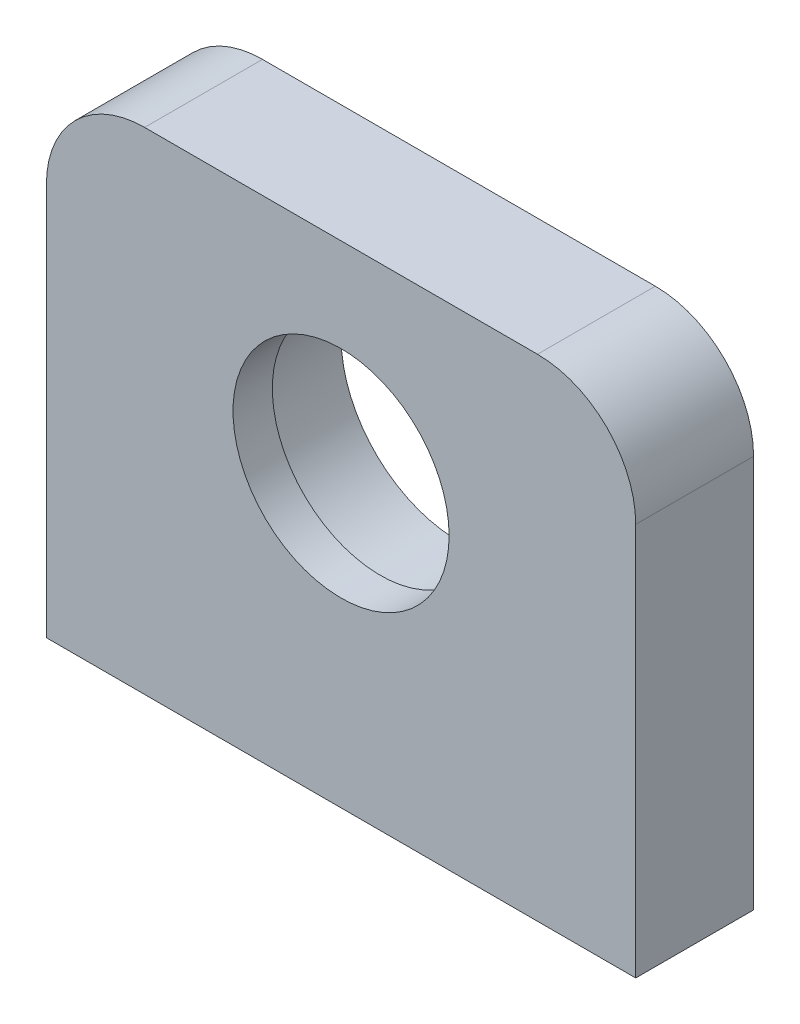
ISO-10303-21;
HEADER;
FILE_DESCRIPTION(('STEP AP214'),'2;1');
FILE_NAME('part.step','',(''),(''),'','','');
FILE_SCHEMA(('AUTOMOTIVE_DESIGN { 1 0 10303 214 1 1 1 1 }'));
ENDSEC;
DATA;
#1=APPLICATION_CONTEXT('core data for automotive mechanical design processes');
#2=APPLICATION_PROTOCOL_DEFINITION('international standard','automotive_design',2000,#1);
#3=PRODUCT_CONTEXT('',#1,'mechanical');
#4=PRODUCT('Part','Part','',(#3));
#5=PRODUCT_RELATED_PRODUCT_CATEGORY('part','',(#4));
#6=PRODUCT_DEFINITION_FORMATION('','',#4);
#7=PRODUCT_DEFINITION_CONTEXT('part definition',#1,'design');
#8=PRODUCT_DEFINITION('design','',#6,#7);
#9=PRODUCT_DEFINITION_SHAPE('','',#8);
#10=(LENGTH_UNIT() NAMED_UNIT(*) SI_UNIT(.MILLI.,.METRE.));
#11=(NAMED_UNIT(*) PLANE_ANGLE_UNIT() SI_UNIT($,.RADIAN.));
#12=(NAMED_UNIT(*) SI_UNIT($,.STERADIAN.) SOLID_ANGLE_UNIT());
#13=UNCERTAINTY_MEASURE_WITH_UNIT(LENGTH_MEASURE(1.E-05),#10,'distance_accuracy_value','');
#14=(GEOMETRIC_REPRESENTATION_CONTEXT(3) GLOBAL_UNCERTAINTY_ASSIGNED_CONTEXT((#13)) GLOBAL_UNIT_ASSIGNED_CONTEXT((#10,
#11,#12)) REPRESENTATION_CONTEXT('',''));
#15=CARTESIAN_POINT('',(0.,0.,0.));
#16=DIRECTION('',(0.,0.,1.));
#17=DIRECTION('',(1.,0.,0.));
#18=AXIS2_PLACEMENT_3D('',#15,#16,#17);
#19=CARTESIAN_POINT('',(30.,-25.,0.));
#20=DIRECTION('',(0.,0.,1.));
#21=DIRECTION('',(1.,0.,0.));
#22=AXIS2_PLACEMENT_3D('',#19,#20,#21);
#23=PLANE('',#22);
#24=CARTESIAN_POINT('',(0.,4.5,0.));
#25=DIRECTION('',(0.,0.,1.));
#26=DIRECTION('',(1.,0.,0.));
#27=AXIS2_PLACEMENT_3D('',#24,#25,#26);
#28=CIRCLE('',#27,12.);
#29=CARTESIAN_POINT('',(12.,4.5,0.));
#30=VERTEX_POINT('',#29);
#31=EDGE_CURVE('E397',#30,#30,#28,.F.);
#32=ORIENTED_EDGE('',*,*,#31,.F.);
#33=EDGE_LOOP('',(#32));
#34=FACE_BOUND('',#33,.T.);
#35=DIRECTION('',(0.,-1.,0.));
#36=VECTOR('',#35,1.);
#37=CARTESIAN_POINT('',(-30.,25.,0.));
#38=LINE('',#37,#36);
#39=CARTESIAN_POINT('',(-30.,15.,0.));
#40=VERTEX_POINT('',#39);
#41=CARTESIAN_POINT('',(-30.,-25.,0.));
#42=VERTEX_POINT('',#41);
#43=EDGE_CURVE('E420',#40,#42,#38,.T.);
#44=ORIENTED_EDGE('',*,*,#43,.F.);
#45=CARTESIAN_POINT('',(-20.,15.,0.));
#46=DIRECTION('',(0.,0.,1.));
#47=DIRECTION('',(1.,0.,0.));
#48=AXIS2_PLACEMENT_3D('',#45,#46,#47);
#49=CIRCLE('',#48,10.);
#50=CARTESIAN_POINT('',(-20.,25.,0.));
#51=VERTEX_POINT('',#50);
#52=EDGE_CURVE('E450',#40,#51,#49,.F.);
#53=ORIENTED_EDGE('',*,*,#52,.T.);
#54=DIRECTION('',(-1.,0.,0.));
#55=VECTOR('',#54,1.);
#56=CARTESIAN_POINT('',(-30.,25.,0.));
#57=LINE('',#56,#55);
#58=CARTESIAN_POINT('',(20.,25.,0.));
#59=VERTEX_POINT('',#58);
#60=EDGE_CURVE('E418',#59,#51,#57,.T.);
#61=ORIENTED_EDGE('',*,*,#60,.F.);
#62=CARTESIAN_POINT('',(20.,15.,0.));
#63=DIRECTION('',(0.,0.,1.));
#64=DIRECTION('',(1.,0.,0.));
#65=AXIS2_PLACEMENT_3D('',#62,#63,#64);
#66=CIRCLE('',#65,10.);
#67=CARTESIAN_POINT('',(30.,15.,0.));
#68=VERTEX_POINT('',#67);
#69=EDGE_CURVE('E448',#59,#68,#66,.F.);
#70=ORIENTED_EDGE('',*,*,#69,.T.);
#71=DIRECTION('',(0.,1.,0.));
#72=VECTOR('',#71,1.);
#73=CARTESIAN_POINT('',(30.,25.,0.));
#74=LINE('',#73,#72);
#75=CARTESIAN_POINT('',(30.,-25.,0.));
#76=VERTEX_POINT('',#75);
#77=EDGE_CURVE('E406',#76,#68,#74,.T.);
#78=ORIENTED_EDGE('',*,*,#77,.F.);
#79=DIRECTION('',(1.,0.,0.));
#80=VECTOR('',#79,1.);
#81=CARTESIAN_POINT('',(-30.,-25.,0.));
#82=LINE('',#81,#80);
#83=CARTESIAN_POINT('',(22.5,-25.,0.));
#84=VERTEX_POINT('',#83);
#85=EDGE_CURVE('E422',#84,#76,#82,.T.);
#86=ORIENTED_EDGE('',*,*,#85,.F.);
#87=DIRECTION('',(0.,-1.,0.));
#88=VECTOR('',#87,1.);
#89=CARTESIAN_POINT('',(22.5,-8.00000000000001,0.));
#90=LINE('',#89,#88);
#91=CARTESIAN_POINT('',(22.5,-15.,0.));
#92=VERTEX_POINT('',#91);
#93=EDGE_CURVE('E332',#92,#84,#90,.T.);
#94=ORIENTED_EDGE('',*,*,#93,.F.);
#95=DIRECTION('',(-1.,0.,0.));
#96=VECTOR('',#95,1.);
#97=CARTESIAN_POINT('',(24.,-15.,0.));
#98=LINE('',#97,#96);
#99=CARTESIAN_POINT('',(24.,-15.,0.));
#100=VERTEX_POINT('',#99);
#101=EDGE_CURVE('E375',#100,#92,#98,.T.);
#102=ORIENTED_EDGE('',*,*,#101,.F.);
#103=CARTESIAN_POINT('',(24.,-13.,0.));
#104=DIRECTION('',(0.,0.,-1.));
#105=DIRECTION('',(-1.,0.,0.));
#106=AXIS2_PLACEMENT_3D('',#103,#104,#105);
#107=CIRCLE('',#106,2.);
#108=CARTESIAN_POINT('',(24.,-11.,0.));
#109=VERTEX_POINT('',#108);
#110=EDGE_CURVE('E358',#109,#100,#107,.T.);
#111=ORIENTED_EDGE('',*,*,#110,.F.);
#112=DIRECTION('',(1.,0.,0.));
#113=VECTOR('',#112,1.);
#114=CARTESIAN_POINT('',(24.,-11.,0.));
#115=LINE('',#114,#113);
#116=CARTESIAN_POINT('',(22.5,-11.,0.));
#117=VERTEX_POINT('',#116);
#118=EDGE_CURVE('E381',#117,#109,#115,.T.);
#119=ORIENTED_EDGE('',*,*,#118,.F.);
#120=CARTESIAN_POINT('',(22.5,-8.00000000000001,0.));
#121=VERTEX_POINT('',#120);
#122=EDGE_CURVE('E333',#121,#117,#90,.T.);
#123=ORIENTED_EDGE('',*,*,#122,.F.);
#124=CARTESIAN_POINT('',(20.,-8.00000000000001,0.));
#125=DIRECTION('',(0.,0.,-1.));
#126=DIRECTION('',(-1.,0.,0.));
#127=AXIS2_PLACEMENT_3D('',#124,#125,#126);
#128=CIRCLE('',#127,2.50000000000001);
#129=CARTESIAN_POINT('',(17.5,-8.00000000000001,0.));
#130=VERTEX_POINT('',#129);
#131=EDGE_CURVE('E312',#130,#121,#128,.T.);
#132=ORIENTED_EDGE('',*,*,#131,.F.);
#133=DIRECTION('',(0.,1.,0.));
#134=VECTOR('',#133,1.);
#135=CARTESIAN_POINT('',(17.5,-8.00000000000001,0.));
#136=LINE('',#135,#134);
#137=CARTESIAN_POINT('',(17.5,-11.,0.));
#138=VERTEX_POINT('',#137);
#139=EDGE_CURVE('E335',#138,#130,#136,.T.);
#140=ORIENTED_EDGE('',*,*,#139,.F.);
#141=CARTESIAN_POINT('',(16.,-11.,0.));
#142=VERTEX_POINT('',#141);
#143=EDGE_CURVE('E363',#142,#138,#115,.T.);
#144=ORIENTED_EDGE('',*,*,#143,.F.);
#145=CARTESIAN_POINT('',(16.,-13.,0.));
#146=DIRECTION('',(0.,0.,-1.));
#147=DIRECTION('',(-1.,0.,0.));
#148=AXIS2_PLACEMENT_3D('',#145,#146,#147);
#149=CIRCLE('',#148,2.);
#150=CARTESIAN_POINT('',(16.,-15.,0.));
#151=VERTEX_POINT('',#150);
#152=EDGE_CURVE('E378',#151,#142,#149,.T.);
#153=ORIENTED_EDGE('',*,*,#152,.F.);
#154=CARTESIAN_POINT('',(17.5,-15.,0.));
#155=VERTEX_POINT('',#154);
#156=EDGE_CURVE('E374',#155,#151,#98,.T.);
#157=ORIENTED_EDGE('',*,*,#156,.F.);
#158=CARTESIAN_POINT('',(17.5,-25.,0.));
#159=VERTEX_POINT('',#158);
#160=EDGE_CURVE('E324',#159,#155,#136,.T.);
#161=ORIENTED_EDGE('',*,*,#160,.F.);
#162=CARTESIAN_POINT('',(-17.5,-25.,0.));
#163=VERTEX_POINT('',#162);
#164=EDGE_CURVE('E425',#163,#159,#82,.T.);
#165=ORIENTED_EDGE('',*,*,#164,.F.);
#166=DIRECTION('',(0.,1.,0.));
#167=VECTOR('',#166,1.);
#168=CARTESIAN_POINT('',(-17.5,-8.00000000000001,0.));
#169=LINE('',#168,#167);
#170=CARTESIAN_POINT('',(-17.5,-15.,0.));
#171=VERTEX_POINT('',#170);
#172=EDGE_CURVE('E267',#163,#171,#169,.T.);
#173=ORIENTED_EDGE('',*,*,#172,.T.);
#174=DIRECTION('',(1.,0.,0.));
#175=VECTOR('',#174,1.);
#176=CARTESIAN_POINT('',(-24.,-15.,0.));
#177=LINE('',#176,#175);
#178=CARTESIAN_POINT('',(-16.,-15.,0.));
#179=VERTEX_POINT('',#178);
#180=EDGE_CURVE('E306',#171,#179,#177,.T.);
#181=ORIENTED_EDGE('',*,*,#180,.T.);
#182=CARTESIAN_POINT('',(-16.,-13.,0.));
#183=DIRECTION('',(0.,0.,1.));
#184=DIRECTION('',(1.,0.,0.));
#185=AXIS2_PLACEMENT_3D('',#182,#183,#184);
#186=CIRCLE('',#185,2.);
#187=CARTESIAN_POINT('',(-16.,-11.,0.));
#188=VERTEX_POINT('',#187);
#189=EDGE_CURVE('E303',#179,#188,#186,.T.);
#190=ORIENTED_EDGE('',*,*,#189,.T.);
#191=DIRECTION('',(-1.,0.,0.));
#192=VECTOR('',#191,1.);
#193=CARTESIAN_POINT('',(-24.,-11.,0.));
#194=LINE('',#193,#192);
#195=CARTESIAN_POINT('',(-17.5,-11.,0.));
#196=VERTEX_POINT('',#195);
#197=EDGE_CURVE('E300',#188,#196,#194,.T.);
#198=ORIENTED_EDGE('',*,*,#197,.T.);
#199=CARTESIAN_POINT('',(-17.5,-8.00000000000001,0.));
#200=VERTEX_POINT('',#199);
#201=EDGE_CURVE('E266',#196,#200,#169,.T.);
#202=ORIENTED_EDGE('',*,*,#201,.T.);
#203=CARTESIAN_POINT('',(-20.,-8.00000000000001,0.));
#204=DIRECTION('',(0.,0.,1.));
#205=DIRECTION('',(1.,0.,0.));
#206=AXIS2_PLACEMENT_3D('',#203,#204,#205);
#207=CIRCLE('',#206,2.50000000000001);
#208=CARTESIAN_POINT('',(-22.5,-8.00000000000001,0.));
#209=VERTEX_POINT('',#208);
#210=EDGE_CURVE('E250',#200,#209,#207,.T.);
#211=ORIENTED_EDGE('',*,*,#210,.T.);
#212=DIRECTION('',(0.,-1.,0.));
#213=VECTOR('',#212,1.);
#214=CARTESIAN_POINT('',(-22.5,-8.00000000000001,0.));
#215=LINE('',#214,#213);
#216=CARTESIAN_POINT('',(-22.5,-11.,0.));
#217=VERTEX_POINT('',#216);
#218=EDGE_CURVE('E257',#209,#217,#215,.T.);
#219=ORIENTED_EDGE('',*,*,#218,.T.);
#220=CARTESIAN_POINT('',(-24.,-11.,0.));
#221=VERTEX_POINT('',#220);
#222=EDGE_CURVE('E299',#217,#221,#194,.T.);
#223=ORIENTED_EDGE('',*,*,#222,.T.);
#224=CARTESIAN_POINT('',(-24.,-13.,0.));
#225=DIRECTION('',(0.,0.,1.));
#226=DIRECTION('',(1.,0.,0.));
#227=AXIS2_PLACEMENT_3D('',#224,#225,#226);
#228=CIRCLE('',#227,2.);
#229=CARTESIAN_POINT('',(-24.,-15.,0.));
#230=VERTEX_POINT('',#229);
#231=EDGE_CURVE('E285',#221,#230,#228,.T.);
#232=ORIENTED_EDGE('',*,*,#231,.T.);
#233=CARTESIAN_POINT('',(-22.5,-15.,0.));
#234=VERTEX_POINT('',#233);
#235=EDGE_CURVE('E290',#230,#234,#177,.T.);
#236=ORIENTED_EDGE('',*,*,#235,.T.);
#237=CARTESIAN_POINT('',(-22.5,-25.,0.));
#238=VERTEX_POINT('',#237);
#239=EDGE_CURVE('E260',#234,#238,#215,.T.);
#240=ORIENTED_EDGE('',*,*,#239,.T.);
#241=EDGE_CURVE('E410',#42,#238,#82,.T.);
#242=ORIENTED_EDGE('',*,*,#241,.F.);
#243=EDGE_LOOP('',(#44,#53,#61,#70,#78,#86,#94,#102,#111,#119,#123,#132,#140,#144,#153,#157,
#161,#165,#173,#181,#190,#198,#202,#211,#219,#223,#232,#236,#240,#242));
#244=FACE_BOUND('',#243,.T.);
#245=ADVANCED_FACE('F33',(#34,#244),#23,.F.);
#246=CARTESIAN_POINT('',(-30.,-25.,12.));
#247=DIRECTION('',(0.,1.,0.));
#248=DIRECTION('',(0.,0.,1.));
#249=AXIS2_PLACEMENT_3D('',#246,#247,#248);
#250=PLANE('',#249);
#251=DIRECTION('',(0.,0.,-1.));
#252=VECTOR('',#251,1.);
#253=CARTESIAN_POINT('',(-22.5,-25.,12.));
#254=LINE('',#253,#252);
#255=CARTESIAN_POINT('',(-22.5,-25.,6.5));
#256=VERTEX_POINT('',#255);
#257=EDGE_CURVE('E283',#256,#238,#254,.T.);
#258=ORIENTED_EDGE('',*,*,#257,.F.);
#259=DIRECTION('',(-1.,0.,0.));
#260=VECTOR('',#259,1.);
#261=CARTESIAN_POINT('',(-30.,-25.,6.5));
#262=LINE('',#261,#260);
#263=CARTESIAN_POINT('',(-17.5,-25.,6.5));
#264=VERTEX_POINT('',#263);
#265=EDGE_CURVE('E273',#264,#256,#262,.T.);
#266=ORIENTED_EDGE('',*,*,#265,.F.);
#267=DIRECTION('',(0.,0.,1.));
#268=VECTOR('',#267,1.);
#269=CARTESIAN_POINT('',(-17.5,-25.,12.));
#270=LINE('',#269,#268);
#271=EDGE_CURVE('E278',#163,#264,#270,.T.);
#272=ORIENTED_EDGE('',*,*,#271,.F.);
#273=ORIENTED_EDGE('',*,*,#164,.T.);
#274=DIRECTION('',(0.,0.,1.));
#275=VECTOR('',#274,1.);
#276=CARTESIAN_POINT('',(17.5,-25.,12.));
#277=LINE('',#276,#275);
#278=CARTESIAN_POINT('',(17.5,-25.,6.5));
#279=VERTEX_POINT('',#278);
#280=EDGE_CURVE('E355',#159,#279,#277,.T.);
#281=ORIENTED_EDGE('',*,*,#280,.T.);
#282=DIRECTION('',(-1.,0.,0.));
#283=VECTOR('',#282,1.);
#284=CARTESIAN_POINT('',(-30.,-25.,6.5));
#285=LINE('',#284,#283);
#286=CARTESIAN_POINT('',(22.5,-25.,6.5));
#287=VERTEX_POINT('',#286);
#288=EDGE_CURVE('E344',#287,#279,#285,.T.);
#289=ORIENTED_EDGE('',*,*,#288,.F.);
#290=DIRECTION('',(0.,0.,-1.));
#291=VECTOR('',#290,1.);
#292=CARTESIAN_POINT('',(22.5,-25.,12.));
#293=LINE('',#292,#291);
#294=EDGE_CURVE('E349',#287,#84,#293,.T.);
#295=ORIENTED_EDGE('',*,*,#294,.T.);
#296=ORIENTED_EDGE('',*,*,#85,.T.);
#297=DIRECTION('',(0.,0.,-1.));
#298=VECTOR('',#297,1.);
#299=CARTESIAN_POINT('',(30.,-25.,12.));
#300=LINE('',#299,#298);
#301=CARTESIAN_POINT('',(30.,-25.,12.));
#302=VERTEX_POINT('',#301);
#303=EDGE_CURVE('E416',#302,#76,#300,.T.);
#304=ORIENTED_EDGE('',*,*,#303,.F.);
#305=DIRECTION('',(1.,0.,0.));
#306=VECTOR('',#305,1.);
#307=CARTESIAN_POINT('',(-30.,-25.,12.));
#308=LINE('',#307,#306);
#309=CARTESIAN_POINT('',(-30.,-25.,12.));
#310=VERTEX_POINT('',#309);
#311=EDGE_CURVE('E414',#310,#302,#308,.T.);
#312=ORIENTED_EDGE('',*,*,#311,.F.);
#313=DIRECTION('',(0.,0.,-1.));
#314=VECTOR('',#313,1.);
#315=CARTESIAN_POINT('',(-30.,-25.,12.));
#316=LINE('',#315,#314);
#317=EDGE_CURVE('E428',#310,#42,#316,.T.);
#318=ORIENTED_EDGE('',*,*,#317,.T.);
#319=ORIENTED_EDGE('',*,*,#241,.T.);
#320=EDGE_LOOP('',(#258,#266,#272,#273,#281,#289,#295,#296,#304,#312,#318,#319));
#321=FACE_BOUND('',#320,.T.);
#322=ADVANCED_FACE('F482',(#321),#250,.F.);
#323=CARTESIAN_POINT('',(-24.,-15.,8.));
#324=DIRECTION('',(0.,1.,0.));
#325=DIRECTION('',(0.,0.,1.));
#326=AXIS2_PLACEMENT_3D('',#323,#324,#325);
#327=PLANE('',#326);
#328=DIRECTION('',(-1.,0.,0.));
#329=VECTOR('',#328,1.);
#330=CARTESIAN_POINT('',(-24.,-15.,6.5));
#331=LINE('',#330,#329);
#332=CARTESIAN_POINT('',(-17.5,-15.,6.5));
#333=VERTEX_POINT('',#332);
#334=CARTESIAN_POINT('',(-22.5,-15.,6.5));
#335=VERTEX_POINT('',#334);
#336=EDGE_CURVE('E269',#333,#335,#331,.T.);
#337=ORIENTED_EDGE('',*,*,#336,.T.);
#338=DIRECTION('',(0.,0.,-1.));
#339=VECTOR('',#338,1.);
#340=CARTESIAN_POINT('',(-22.5,-15.,8.));
#341=LINE('',#340,#339);
#342=EDGE_CURVE('E280',#335,#234,#341,.T.);
#343=ORIENTED_EDGE('',*,*,#342,.T.);
#344=ORIENTED_EDGE('',*,*,#235,.F.);
#345=DIRECTION('',(0.,0.,-1.));
#346=VECTOR('',#345,1.);
#347=CARTESIAN_POINT('',(-24.,-15.,8.));
#348=LINE('',#347,#346);
#349=CARTESIAN_POINT('',(-24.,-15.,8.));
#350=VERTEX_POINT('',#349);
#351=EDGE_CURVE('E309',#350,#230,#348,.T.);
#352=ORIENTED_EDGE('',*,*,#351,.F.);
#353=DIRECTION('',(1.,0.,0.));
#354=VECTOR('',#353,1.);
#355=CARTESIAN_POINT('',(-24.,-15.,8.));
#356=LINE('',#355,#354);
#357=CARTESIAN_POINT('',(-16.,-15.,8.));
#358=VERTEX_POINT('',#357);
#359=EDGE_CURVE('E294',#350,#358,#356,.T.);
#360=ORIENTED_EDGE('',*,*,#359,.T.);
#361=DIRECTION('',(0.,0.,-1.));
#362=VECTOR('',#361,1.);
#363=CARTESIAN_POINT('',(-16.,-15.,8.));
#364=LINE('',#363,#362);
#365=EDGE_CURVE('E313',#358,#179,#364,.T.);
#366=ORIENTED_EDGE('',*,*,#365,.T.);
#367=ORIENTED_EDGE('',*,*,#180,.F.);
#368=DIRECTION('',(0.,0.,1.));
#369=VECTOR('',#368,1.);
#370=CARTESIAN_POINT('',(-17.5,-15.,8.));
#371=LINE('',#370,#369);
#372=EDGE_CURVE('E275',#171,#333,#371,.T.);
#373=ORIENTED_EDGE('',*,*,#372,.T.);
#374=EDGE_LOOP('',(#337,#343,#344,#352,#360,#366,#367,#373));
#375=FACE_BOUND('',#374,.T.);
#376=ADVANCED_FACE('F542',(#375),#327,.T.);
#377=CARTESIAN_POINT('',(-24.,-11.,8.));
#378=DIRECTION('',(0.,-1.,0.));
#379=DIRECTION('',(0.,0.,-1.));
#380=AXIS2_PLACEMENT_3D('',#377,#378,#379);
#381=PLANE('',#380);
#382=ORIENTED_EDGE('',*,*,#222,.F.);
#383=DIRECTION('',(0.,0.,1.));
#384=VECTOR('',#383,1.);
#385=CARTESIAN_POINT('',(-22.5,-11.,8.));
#386=LINE('',#385,#384);
#387=CARTESIAN_POINT('',(-22.5,-11.,6.5));
#388=VERTEX_POINT('',#387);
#389=EDGE_CURVE('E442',#217,#388,#386,.T.);
#390=ORIENTED_EDGE('',*,*,#389,.T.);
#391=DIRECTION('',(1.,0.,0.));
#392=VECTOR('',#391,1.);
#393=CARTESIAN_POINT('',(-24.,-11.,6.5));
#394=LINE('',#393,#392);
#395=CARTESIAN_POINT('',(-17.5,-11.,6.5));
#396=VERTEX_POINT('',#395);
#397=EDGE_CURVE('E439',#388,#396,#394,.T.);
#398=ORIENTED_EDGE('',*,*,#397,.T.);
#399=DIRECTION('',(0.,0.,-1.));
#400=VECTOR('',#399,1.);
#401=CARTESIAN_POINT('',(-17.5,-11.,8.));
#402=LINE('',#401,#400);
#403=EDGE_CURVE('E237',#396,#196,#402,.T.);
#404=ORIENTED_EDGE('',*,*,#403,.T.);
#405=ORIENTED_EDGE('',*,*,#197,.F.);
#406=DIRECTION('',(0.,0.,-1.));
#407=VECTOR('',#406,1.);
#408=CARTESIAN_POINT('',(-16.,-11.,8.));
#409=LINE('',#408,#407);
#410=CARTESIAN_POINT('',(-16.,-11.,8.));
#411=VERTEX_POINT('',#410);
#412=EDGE_CURVE('E316',#411,#188,#409,.T.);
#413=ORIENTED_EDGE('',*,*,#412,.F.);
#414=DIRECTION('',(-1.,0.,0.));
#415=VECTOR('',#414,1.);
#416=CARTESIAN_POINT('',(-24.,-11.,8.));
#417=LINE('',#416,#415);
#418=CARTESIAN_POINT('',(-24.,-11.,8.));
#419=VERTEX_POINT('',#418);
#420=EDGE_CURVE('E289',#411,#419,#417,.T.);
#421=ORIENTED_EDGE('',*,*,#420,.T.);
#422=DIRECTION('',(0.,0.,-1.));
#423=VECTOR('',#422,1.);
#424=CARTESIAN_POINT('',(-24.,-11.,8.));
#425=LINE('',#424,#423);
#426=EDGE_CURVE('E296',#419,#221,#425,.T.);
#427=ORIENTED_EDGE('',*,*,#426,.T.);
#428=EDGE_LOOP('',(#382,#390,#398,#404,#405,#413,#421,#427));
#429=FACE_BOUND('',#428,.T.);
#430=ADVANCED_FACE('F552',(#429),#381,.T.);
#431=CARTESIAN_POINT('',(30.,25.,12.));
#432=DIRECTION('',(-1.,0.,0.));
#433=DIRECTION('',(0.,-1.,0.));
#434=AXIS2_PLACEMENT_3D('',#431,#432,#433);
#435=PLANE('',#434);
#436=ORIENTED_EDGE('',*,*,#77,.T.);
#437=DIRECTION('',(0.,0.,-1.));
#438=VECTOR('',#437,1.);
#439=CARTESIAN_POINT('',(30.,15.,12.));
#440=LINE('',#439,#438);
#441=CARTESIAN_POINT('',(30.,15.,12.));
#442=VERTEX_POINT('',#441);
#443=EDGE_CURVE('E11',#68,#442,#440,.F.);
#444=ORIENTED_EDGE('',*,*,#443,.T.);
#445=DIRECTION('',(0.,1.,0.));
#446=VECTOR('',#445,1.);
#447=CARTESIAN_POINT('',(30.,25.,12.));
#448=LINE('',#447,#446);
#449=EDGE_CURVE('E407',#302,#442,#448,.T.);
#450=ORIENTED_EDGE('',*,*,#449,.F.);
#451=ORIENTED_EDGE('',*,*,#303,.T.);
#452=EDGE_LOOP('',(#436,#444,#450,#451));
#453=FACE_BOUND('',#452,.T.);
#454=ADVANCED_FACE('F478',(#453),#435,.F.);
#455=CARTESIAN_POINT('',(-30.,25.,12.));
#456=DIRECTION('',(0.,-1.,0.));
#457=DIRECTION('',(0.,0.,-1.));
#458=AXIS2_PLACEMENT_3D('',#455,#456,#457);
#459=PLANE('',#458);
#460=ORIENTED_EDGE('',*,*,#60,.T.);
#461=DIRECTION('',(0.,0.,-1.));
#462=VECTOR('',#461,1.);
#463=CARTESIAN_POINT('',(-20.,25.,12.));
#464=LINE('',#463,#462);
#465=CARTESIAN_POINT('',(-20.,25.,12.));
#466=VERTEX_POINT('',#465);
#467=EDGE_CURVE('E54',#51,#466,#464,.F.);
#468=ORIENTED_EDGE('',*,*,#467,.T.);
#469=DIRECTION('',(-1.,0.,0.));
#470=VECTOR('',#469,1.);
#471=CARTESIAN_POINT('',(-30.,25.,12.));
#472=LINE('',#471,#470);
#473=CARTESIAN_POINT('',(20.,25.,12.));
#474=VERTEX_POINT('',#473);
#475=EDGE_CURVE('E409',#474,#466,#472,.T.);
#476=ORIENTED_EDGE('',*,*,#475,.F.);
#477=DIRECTION('',(0.,0.,-1.));
#478=VECTOR('',#477,1.);
#479=CARTESIAN_POINT('',(20.,25.,12.));
#480=LINE('',#479,#478);
#481=EDGE_CURVE('E452',#474,#59,#480,.T.);
#482=ORIENTED_EDGE('',*,*,#481,.T.);
#483=EDGE_LOOP('',(#460,#468,#476,#482));
#484=FACE_BOUND('',#483,.T.);
#485=ADVANCED_FACE('F472',(#484),#459,.F.);
#486=CARTESIAN_POINT('',(-30.,25.,12.));
#487=DIRECTION('',(1.,0.,0.));
#488=DIRECTION('',(0.,1.,0.));
#489=AXIS2_PLACEMENT_3D('',#486,#487,#488);
#490=PLANE('',#489);
#491=DIRECTION('',(0.,-1.,0.));
#492=VECTOR('',#491,1.);
#493=CARTESIAN_POINT('',(-30.,25.,12.));
#494=LINE('',#493,#492);
#495=CARTESIAN_POINT('',(-30.,15.,12.));
#496=VERTEX_POINT('',#495);
#497=EDGE_CURVE('E412',#496,#310,#494,.T.);
#498=ORIENTED_EDGE('',*,*,#497,.F.);
#499=DIRECTION('',(0.,0.,-1.));
#500=VECTOR('',#499,1.);
#501=CARTESIAN_POINT('',(-30.,15.,12.));
#502=LINE('',#501,#500);
#503=EDGE_CURVE('E445',#496,#40,#502,.T.);
#504=ORIENTED_EDGE('',*,*,#503,.T.);
#505=ORIENTED_EDGE('',*,*,#43,.T.);
#506=ORIENTED_EDGE('',*,*,#317,.F.);
#507=EDGE_LOOP('',(#498,#504,#505,#506));
#508=FACE_BOUND('',#507,.T.);
#509=ADVANCED_FACE('F465',(#508),#490,.F.);
#510=CARTESIAN_POINT('',(30.,-25.,12.));
#511=DIRECTION('',(0.,0.,1.));
#512=DIRECTION('',(1.,0.,0.));
#513=AXIS2_PLACEMENT_3D('',#510,#511,#512);
#514=PLANE('',#513);
#515=CARTESIAN_POINT('',(0.,4.5,12.));
#516=DIRECTION('',(0.,0.,1.));
#517=DIRECTION('',(1.,0.,0.));
#518=AXIS2_PLACEMENT_3D('',#515,#516,#517);
#519=CIRCLE('',#518,11.);
#520=CARTESIAN_POINT('',(11.,4.5,12.));
#521=VERTEX_POINT('',#520);
#522=EDGE_CURVE('E403',#521,#521,#519,.T.);
#523=ORIENTED_EDGE('',*,*,#522,.F.);
#524=EDGE_LOOP('',(#523));
#525=FACE_BOUND('',#524,.T.);
#526=ORIENTED_EDGE('',*,*,#475,.T.);
#527=CARTESIAN_POINT('',(-20.,15.,12.));
#528=DIRECTION('',(0.,0.,1.));
#529=DIRECTION('',(1.,0.,0.));
#530=AXIS2_PLACEMENT_3D('',#527,#528,#529);
#531=CIRCLE('',#530,10.);
#532=EDGE_CURVE('E41',#466,#496,#531,.T.);
#533=ORIENTED_EDGE('',*,*,#532,.T.);
#534=ORIENTED_EDGE('',*,*,#497,.T.);
#535=ORIENTED_EDGE('',*,*,#311,.T.);
#536=ORIENTED_EDGE('',*,*,#449,.T.);
#537=CARTESIAN_POINT('',(20.,15.,12.));
#538=DIRECTION('',(0.,0.,1.));
#539=DIRECTION('',(1.,0.,0.));
#540=AXIS2_PLACEMENT_3D('',#537,#538,#539);
#541=CIRCLE('',#540,10.);
#542=EDGE_CURVE('E456',#442,#474,#541,.T.);
#543=ORIENTED_EDGE('',*,*,#542,.T.);
#544=EDGE_LOOP('',(#526,#533,#534,#535,#536,#543));
#545=FACE_BOUND('',#544,.T.);
#546=ADVANCED_FACE('F460',(#525,#545),#514,.T.);
#547=CARTESIAN_POINT('',(0.,4.5,8.));
#548=DIRECTION('',(0.,0.,1.));
#549=DIRECTION('',(1.,0.,0.));
#550=AXIS2_PLACEMENT_3D('',#547,#548,#549);
#551=CYLINDRICAL_SURFACE('',#550,11.);
#552=CARTESIAN_POINT('',(0.,4.5,8.));
#553=DIRECTION('',(0.,0.,1.));
#554=DIRECTION('',(1.,0.,0.));
#555=AXIS2_PLACEMENT_3D('',#552,#553,#554);
#556=CIRCLE('',#555,11.);
#557=CARTESIAN_POINT('',(11.,4.5,8.));
#558=VERTEX_POINT('',#557);
#559=EDGE_CURVE('E400',#558,#558,#556,.F.);
#560=ORIENTED_EDGE('',*,*,#559,.T.);
#561=EDGE_LOOP('',(#560));
#562=FACE_BOUND('',#561,.T.);
#563=ORIENTED_EDGE('',*,*,#522,.T.);
#564=EDGE_LOOP('',(#563));
#565=FACE_BOUND('',#564,.T.);
#566=ADVANCED_FACE('F651',(#562,#565),#551,.F.);
#567=CARTESIAN_POINT('',(0.,4.5,8.));
#568=DIRECTION('',(0.,0.,1.));
#569=DIRECTION('',(1.,0.,0.));
#570=AXIS2_PLACEMENT_3D('',#567,#568,#569);
#571=PLANE('',#570);
#572=CARTESIAN_POINT('',(0.,4.5,8.));
#573=DIRECTION('',(0.,0.,1.));
#574=DIRECTION('',(1.,0.,0.));
#575=AXIS2_PLACEMENT_3D('',#572,#573,#574);
#576=CIRCLE('',#575,12.);
#577=CARTESIAN_POINT('',(12.,4.5,8.));
#578=VERTEX_POINT('',#577);
#579=EDGE_CURVE('E387',#578,#578,#576,.T.);
#580=ORIENTED_EDGE('',*,*,#579,.F.);
#581=EDGE_LOOP('',(#580));
#582=FACE_BOUND('',#581,.T.);
#583=ORIENTED_EDGE('',*,*,#559,.F.);
#584=EDGE_LOOP('',(#583));
#585=FACE_BOUND('',#584,.T.);
#586=ADVANCED_FACE('F805',(#582,#585),#571,.F.);
#587=CARTESIAN_POINT('',(0.,4.5,-0.000999999999999265));
#588=DIRECTION('',(0.,0.,1.));
#589=DIRECTION('',(1.,0.,0.));
#590=AXIS2_PLACEMENT_3D('',#587,#588,#589);
#591=CYLINDRICAL_SURFACE('',#590,12.);
#592=ORIENTED_EDGE('',*,*,#579,.T.);
#593=EDGE_LOOP('',(#592));
#594=FACE_BOUND('',#593,.T.);
#595=ORIENTED_EDGE('',*,*,#31,.T.);
#596=EDGE_LOOP('',(#595));
#597=FACE_BOUND('',#596,.T.);
#598=ADVANCED_FACE('F797',(#594,#597),#591,.F.);
#599=CARTESIAN_POINT('',(24.,-13.,8.));
#600=DIRECTION('',(0.,0.,-1.));
#601=DIRECTION('',(-1.,0.,0.));
#602=AXIS2_PLACEMENT_3D('',#599,#600,#601);
#603=CYLINDRICAL_SURFACE('',#602,2.);
#604=ORIENTED_EDGE('',*,*,#110,.T.);
#605=DIRECTION('',(0.,0.,-1.));
#606=VECTOR('',#605,1.);
#607=CARTESIAN_POINT('',(24.,-15.,8.));
#608=LINE('',#607,#606);
#609=CARTESIAN_POINT('',(24.,-15.,8.));
#610=VERTEX_POINT('',#609);
#611=EDGE_CURVE('E372',#610,#100,#608,.T.);
#612=ORIENTED_EDGE('',*,*,#611,.F.);
#613=CARTESIAN_POINT('',(24.,-13.,8.));
#614=DIRECTION('',(0.,0.,-1.));
#615=DIRECTION('',(-1.,0.,0.));
#616=AXIS2_PLACEMENT_3D('',#613,#614,#615);
#617=CIRCLE('',#616,2.);
#618=CARTESIAN_POINT('',(24.,-11.,8.));
#619=VERTEX_POINT('',#618);
#620=EDGE_CURVE('E359',#619,#610,#617,.T.);
#621=ORIENTED_EDGE('',*,*,#620,.F.);
#622=DIRECTION('',(0.,0.,-1.));
#623=VECTOR('',#622,1.);
#624=CARTESIAN_POINT('',(24.,-11.,8.));
#625=LINE('',#624,#623);
#626=EDGE_CURVE('E384',#619,#109,#625,.T.);
#627=ORIENTED_EDGE('',*,*,#626,.T.);
#628=EDGE_LOOP('',(#604,#612,#621,#627));
#629=FACE_BOUND('',#628,.T.);
#630=ADVANCED_FACE('F789',(#629),#603,.F.);
#631=CARTESIAN_POINT('',(24.,-11.,8.));
#632=DIRECTION('',(0.,1.,0.));
#633=DIRECTION('',(0.,0.,1.));
#634=AXIS2_PLACEMENT_3D('',#631,#632,#633);
#635=PLANE('',#634);
#636=ORIENTED_EDGE('',*,*,#143,.T.);
#637=DIRECTION('',(0.,0.,1.));
#638=VECTOR('',#637,1.);
#639=CARTESIAN_POINT('',(17.5,-11.,8.));
#640=LINE('',#639,#638);
#641=CARTESIAN_POINT('',(17.5,-11.,6.5));
#642=VERTEX_POINT('',#641);
#643=EDGE_CURVE('E352',#138,#642,#640,.T.);
#644=ORIENTED_EDGE('',*,*,#643,.T.);
#645=DIRECTION('',(-1.,0.,0.));
#646=VECTOR('',#645,1.);
#647=CARTESIAN_POINT('',(24.,-11.,6.5));
#648=LINE('',#647,#646);
#649=CARTESIAN_POINT('',(22.5,-11.,6.5));
#650=VERTEX_POINT('',#649);
#651=EDGE_CURVE('E340',#650,#642,#648,.T.);
#652=ORIENTED_EDGE('',*,*,#651,.F.);
#653=DIRECTION('',(0.,0.,-1.));
#654=VECTOR('',#653,1.);
#655=CARTESIAN_POINT('',(22.5,-11.,8.));
#656=LINE('',#655,#654);
#657=EDGE_CURVE('E346',#650,#117,#656,.T.);
#658=ORIENTED_EDGE('',*,*,#657,.T.);
#659=ORIENTED_EDGE('',*,*,#118,.T.);
#660=ORIENTED_EDGE('',*,*,#626,.F.);
#661=DIRECTION('',(1.,0.,0.));
#662=VECTOR('',#661,1.);
#663=CARTESIAN_POINT('',(24.,-11.,8.));
#664=LINE('',#663,#662);
#665=CARTESIAN_POINT('',(16.,-11.,8.));
#666=VERTEX_POINT('',#665);
#667=EDGE_CURVE('E369',#666,#619,#664,.T.);
#668=ORIENTED_EDGE('',*,*,#667,.F.);
#669=DIRECTION('',(0.,0.,-1.));
#670=VECTOR('',#669,1.);
#671=CARTESIAN_POINT('',(16.,-11.,8.));
#672=LINE('',#671,#670);
#673=EDGE_CURVE('E388',#666,#142,#672,.T.);
#674=ORIENTED_EDGE('',*,*,#673,.T.);
#675=EDGE_LOOP('',(#636,#644,#652,#658,#659,#660,#668,#674));
#676=FACE_BOUND('',#675,.T.);
#677=ADVANCED_FACE('F781',(#676),#635,.F.);
#678=CARTESIAN_POINT('',(16.,-13.,8.));
#679=DIRECTION('',(0.,0.,-1.));
#680=DIRECTION('',(-1.,0.,0.));
#681=AXIS2_PLACEMENT_3D('',#678,#679,#680);
#682=CYLINDRICAL_SURFACE('',#681,2.);
#683=ORIENTED_EDGE('',*,*,#152,.T.);
#684=ORIENTED_EDGE('',*,*,#673,.F.);
#685=CARTESIAN_POINT('',(16.,-13.,8.));
#686=DIRECTION('',(0.,0.,-1.));
#687=DIRECTION('',(-1.,0.,0.));
#688=AXIS2_PLACEMENT_3D('',#685,#686,#687);
#689=CIRCLE('',#688,2.);
#690=CARTESIAN_POINT('',(16.,-15.,8.));
#691=VERTEX_POINT('',#690);
#692=EDGE_CURVE('E366',#691,#666,#689,.T.);
#693=ORIENTED_EDGE('',*,*,#692,.F.);
#694=DIRECTION('',(0.,0.,-1.));
#695=VECTOR('',#694,1.);
#696=CARTESIAN_POINT('',(16.,-15.,8.));
#697=LINE('',#696,#695);
#698=EDGE_CURVE('E390',#691,#151,#697,.T.);
#699=ORIENTED_EDGE('',*,*,#698,.T.);
#700=EDGE_LOOP('',(#683,#684,#693,#699));
#701=FACE_BOUND('',#700,.T.);
#702=ADVANCED_FACE('F504',(#701),#682,.F.);
#703=CARTESIAN_POINT('',(24.,-15.,8.));
#704=DIRECTION('',(0.,-1.,0.));
#705=DIRECTION('',(0.,0.,-1.));
#706=AXIS2_PLACEMENT_3D('',#703,#704,#705);
#707=PLANE('',#706);
#708=DIRECTION('',(1.,0.,0.));
#709=VECTOR('',#708,1.);
#710=CARTESIAN_POINT('',(24.,-15.,6.5));
#711=LINE('',#710,#709);
#712=CARTESIAN_POINT('',(17.5,-15.,6.5));
#713=VERTEX_POINT('',#712);
#714=CARTESIAN_POINT('',(22.5,-15.,6.5));
#715=VERTEX_POINT('',#714);
#716=EDGE_CURVE('E431',#713,#715,#711,.T.);
#717=ORIENTED_EDGE('',*,*,#716,.F.);
#718=DIRECTION('',(0.,0.,-1.));
#719=VECTOR('',#718,1.);
#720=CARTESIAN_POINT('',(17.5,-15.,8.));
#721=LINE('',#720,#719);
#722=EDGE_CURVE('E436',#713,#155,#721,.T.);
#723=ORIENTED_EDGE('',*,*,#722,.T.);
#724=ORIENTED_EDGE('',*,*,#156,.T.);
#725=ORIENTED_EDGE('',*,*,#698,.F.);
#726=DIRECTION('',(-1.,0.,0.));
#727=VECTOR('',#726,1.);
#728=CARTESIAN_POINT('',(24.,-15.,8.));
#729=LINE('',#728,#727);
#730=EDGE_CURVE('E362',#610,#691,#729,.T.);
#731=ORIENTED_EDGE('',*,*,#730,.F.);
#732=ORIENTED_EDGE('',*,*,#611,.T.);
#733=ORIENTED_EDGE('',*,*,#101,.T.);
#734=DIRECTION('',(0.,0.,1.));
#735=VECTOR('',#734,1.);
#736=CARTESIAN_POINT('',(22.5,-15.,8.));
#737=LINE('',#736,#735);
#738=EDGE_CURVE('E433',#92,#715,#737,.T.);
#739=ORIENTED_EDGE('',*,*,#738,.T.);
#740=EDGE_LOOP('',(#717,#723,#724,#725,#731,#732,#733,#739));
#741=FACE_BOUND('',#740,.T.);
#742=ADVANCED_FACE('F500',(#741),#707,.F.);
#743=CARTESIAN_POINT('',(24.,-13.,8.));
#744=DIRECTION('',(0.,0.,-1.));
#745=DIRECTION('',(-1.,0.,0.));
#746=AXIS2_PLACEMENT_3D('',#743,#744,#745);
#747=PLANE('',#746);
#748=ORIENTED_EDGE('',*,*,#620,.T.);
#749=ORIENTED_EDGE('',*,*,#730,.T.);
#750=ORIENTED_EDGE('',*,*,#692,.T.);
#751=ORIENTED_EDGE('',*,*,#667,.T.);
#752=EDGE_LOOP('',(#748,#749,#750,#751));
#753=FACE_BOUND('',#752,.T.);
#754=ADVANCED_FACE('F507',(#753),#747,.T.);
#755=CARTESIAN_POINT('',(20.,-8.00000000000001,6.5));
#756=DIRECTION('',(0.,0.,-1.));
#757=DIRECTION('',(-1.,0.,0.));
#758=AXIS2_PLACEMENT_3D('',#755,#756,#757);
#759=PLANE('',#758);
#760=ORIENTED_EDGE('',*,*,#288,.T.);
#761=DIRECTION('',(0.,1.,0.));
#762=VECTOR('',#761,1.);
#763=CARTESIAN_POINT('',(17.5,-8.00000000000001,6.5));
#764=LINE('',#763,#762);
#765=EDGE_CURVE('E329',#279,#713,#764,.T.);
#766=ORIENTED_EDGE('',*,*,#765,.T.);
#767=ORIENTED_EDGE('',*,*,#716,.T.);
#768=DIRECTION('',(0.,-1.,0.));
#769=VECTOR('',#768,1.);
#770=CARTESIAN_POINT('',(22.5,-8.00000000000001,6.5));
#771=LINE('',#770,#769);
#772=EDGE_CURVE('E323',#715,#287,#771,.T.);
#773=ORIENTED_EDGE('',*,*,#772,.T.);
#774=EDGE_LOOP('',(#760,#766,#767,#773));
#775=FACE_BOUND('',#774,.T.);
#776=ADVANCED_FACE('F518',(#775),#759,.T.);
#777=CARTESIAN_POINT('',(22.5,-8.00000000000001,6.5));
#778=DIRECTION('',(1.,0.,0.));
#779=DIRECTION('',(0.,1.,0.));
#780=AXIS2_PLACEMENT_3D('',#777,#778,#779);
#781=PLANE('',#780);
#782=ORIENTED_EDGE('',*,*,#772,.F.);
#783=ORIENTED_EDGE('',*,*,#738,.F.);
#784=ORIENTED_EDGE('',*,*,#93,.T.);
#785=ORIENTED_EDGE('',*,*,#294,.F.);
#786=EDGE_LOOP('',(#782,#783,#784,#785));
#787=FACE_BOUND('',#786,.T.);
#788=ADVANCED_FACE('F515',(#787),#781,.F.);
#789=CARTESIAN_POINT('',(17.5,-8.00000000000001,6.5));
#790=DIRECTION('',(-1.,0.,0.));
#791=DIRECTION('',(0.,-1.,0.));
#792=AXIS2_PLACEMENT_3D('',#789,#790,#791);
#793=PLANE('',#792);
#794=ORIENTED_EDGE('',*,*,#160,.T.);
#795=ORIENTED_EDGE('',*,*,#722,.F.);
#796=ORIENTED_EDGE('',*,*,#765,.F.);
#797=ORIENTED_EDGE('',*,*,#280,.F.);
#798=EDGE_LOOP('',(#794,#795,#796,#797));
#799=FACE_BOUND('',#798,.T.);
#800=ADVANCED_FACE('F493',(#799),#793,.F.);
#801=ORIENTED_EDGE('',*,*,#139,.T.);
#802=DIRECTION('',(0.,0.,-1.));
#803=VECTOR('',#802,1.);
#804=CARTESIAN_POINT('',(17.5,-8.00000000000001,6.5));
#805=LINE('',#804,#803);
#806=CARTESIAN_POINT('',(17.5,-8.00000000000001,6.5));
#807=VERTEX_POINT('',#806);
#808=EDGE_CURVE('E337',#807,#130,#805,.T.);
#809=ORIENTED_EDGE('',*,*,#808,.F.);
#810=EDGE_CURVE('E327',#642,#807,#764,.T.);
#811=ORIENTED_EDGE('',*,*,#810,.F.);
#812=ORIENTED_EDGE('',*,*,#643,.F.);
#813=EDGE_LOOP('',(#801,#809,#811,#812));
#814=FACE_BOUND('',#813,.T.);
#815=ADVANCED_FACE('F738',(#814),#793,.F.);
#816=CARTESIAN_POINT('',(22.5,-8.00000000000001,6.5));
#817=VERTEX_POINT('',#816);
#818=EDGE_CURVE('E325',#817,#650,#771,.T.);
#819=ORIENTED_EDGE('',*,*,#818,.F.);
#820=DIRECTION('',(0.,0.,-1.));
#821=VECTOR('',#820,1.);
#822=CARTESIAN_POINT('',(22.5,-8.00000000000001,6.5));
#823=LINE('',#822,#821);
#824=EDGE_CURVE('E341',#817,#121,#823,.T.);
#825=ORIENTED_EDGE('',*,*,#824,.T.);
#826=ORIENTED_EDGE('',*,*,#122,.T.);
#827=ORIENTED_EDGE('',*,*,#657,.F.);
#828=EDGE_LOOP('',(#819,#825,#826,#827));
#829=FACE_BOUND('',#828,.T.);
#830=ADVANCED_FACE('F527',(#829),#781,.F.);
#831=ORIENTED_EDGE('',*,*,#651,.T.);
#832=ORIENTED_EDGE('',*,*,#810,.T.);
#833=CARTESIAN_POINT('',(20.,-8.00000000000001,6.5));
#834=DIRECTION('',(0.,0.,-1.));
#835=DIRECTION('',(-1.,0.,0.));
#836=AXIS2_PLACEMENT_3D('',#833,#834,#835);
#837=CIRCLE('',#836,2.50000000000001);
#838=EDGE_CURVE('E320',#807,#817,#837,.T.);
#839=ORIENTED_EDGE('',*,*,#838,.T.);
#840=ORIENTED_EDGE('',*,*,#818,.T.);
#841=EDGE_LOOP('',(#831,#832,#839,#840));
#842=FACE_BOUND('',#841,.T.);
#843=ADVANCED_FACE('F521',(#842),#759,.T.);
#844=CARTESIAN_POINT('',(20.,-8.00000000000001,6.5));
#845=DIRECTION('',(0.,0.,-1.));
#846=DIRECTION('',(-1.,0.,0.));
#847=AXIS2_PLACEMENT_3D('',#844,#845,#846);
#848=CYLINDRICAL_SURFACE('',#847,2.50000000000001);
#849=ORIENTED_EDGE('',*,*,#131,.T.);
#850=ORIENTED_EDGE('',*,*,#824,.F.);
#851=ORIENTED_EDGE('',*,*,#838,.F.);
#852=ORIENTED_EDGE('',*,*,#808,.T.);
#853=EDGE_LOOP('',(#849,#850,#851,#852));
#854=FACE_BOUND('',#853,.T.);
#855=ADVANCED_FACE('F532',(#854),#848,.F.);
#856=CARTESIAN_POINT('',(-24.,-13.,8.));
#857=DIRECTION('',(0.,0.,-1.));
#858=DIRECTION('',(-1.,0.,0.));
#859=AXIS2_PLACEMENT_3D('',#856,#857,#858);
#860=CYLINDRICAL_SURFACE('',#859,2.);
#861=ORIENTED_EDGE('',*,*,#231,.F.);
#862=ORIENTED_EDGE('',*,*,#426,.F.);
#863=CARTESIAN_POINT('',(-24.,-13.,8.));
#864=DIRECTION('',(0.,0.,1.));
#865=DIRECTION('',(1.,0.,0.));
#866=AXIS2_PLACEMENT_3D('',#863,#864,#865);
#867=CIRCLE('',#866,2.);
#868=EDGE_CURVE('E286',#419,#350,#867,.T.);
#869=ORIENTED_EDGE('',*,*,#868,.T.);
#870=ORIENTED_EDGE('',*,*,#351,.T.);
#871=EDGE_LOOP('',(#861,#862,#869,#870));
#872=FACE_BOUND('',#871,.T.);
#873=ADVANCED_FACE('F581',(#872),#860,.F.);
#874=CARTESIAN_POINT('',(-16.,-13.,8.));
#875=DIRECTION('',(0.,0.,-1.));
#876=DIRECTION('',(-1.,0.,0.));
#877=AXIS2_PLACEMENT_3D('',#874,#875,#876);
#878=CYLINDRICAL_SURFACE('',#877,2.);
#879=ORIENTED_EDGE('',*,*,#189,.F.);
#880=ORIENTED_EDGE('',*,*,#365,.F.);
#881=CARTESIAN_POINT('',(-16.,-13.,8.));
#882=DIRECTION('',(0.,0.,1.));
#883=DIRECTION('',(1.,0.,0.));
#884=AXIS2_PLACEMENT_3D('',#881,#882,#883);
#885=CIRCLE('',#884,2.);
#886=EDGE_CURVE('E292',#358,#411,#885,.T.);
#887=ORIENTED_EDGE('',*,*,#886,.T.);
#888=ORIENTED_EDGE('',*,*,#412,.T.);
#889=EDGE_LOOP('',(#879,#880,#887,#888));
#890=FACE_BOUND('',#889,.T.);
#891=ADVANCED_FACE('F575',(#890),#878,.F.);
#892=CARTESIAN_POINT('',(-24.,-13.,8.));
#893=DIRECTION('',(0.,0.,-1.));
#894=DIRECTION('',(1.,0.,0.));
#895=AXIS2_PLACEMENT_3D('',#892,#893,#894);
#896=PLANE('',#895);
#897=ORIENTED_EDGE('',*,*,#868,.F.);
#898=ORIENTED_EDGE('',*,*,#420,.F.);
#899=ORIENTED_EDGE('',*,*,#886,.F.);
#900=ORIENTED_EDGE('',*,*,#359,.F.);
#901=EDGE_LOOP('',(#897,#898,#899,#900));
#902=FACE_BOUND('',#901,.T.);
#903=ADVANCED_FACE('F569',(#902),#896,.T.);
#904=CARTESIAN_POINT('',(-20.,-8.00000000000001,6.5));
#905=DIRECTION('',(0.,0.,-1.));
#906=DIRECTION('',(1.,0.,0.));
#907=AXIS2_PLACEMENT_3D('',#904,#905,#906);
#908=PLANE('',#907);
#909=DIRECTION('',(0.,-1.,0.));
#910=VECTOR('',#909,1.);
#911=CARTESIAN_POINT('',(-22.5,-8.00000000000001,6.5));
#912=LINE('',#911,#910);
#913=CARTESIAN_POINT('',(-22.5,-8.00000000000001,6.5));
#914=VERTEX_POINT('',#913);
#915=EDGE_CURVE('E253',#914,#388,#912,.T.);
#916=ORIENTED_EDGE('',*,*,#915,.F.);
#917=CARTESIAN_POINT('',(-20.,-8.00000000000001,6.5));
#918=DIRECTION('',(0.,0.,1.));
#919=DIRECTION('',(1.,0.,0.));
#920=AXIS2_PLACEMENT_3D('',#917,#918,#919);
#921=CIRCLE('',#920,2.50000000000001);
#922=CARTESIAN_POINT('',(-17.5,-8.00000000000001,6.5));
#923=VERTEX_POINT('',#922);
#924=EDGE_CURVE('E242',#923,#914,#921,.T.);
#925=ORIENTED_EDGE('',*,*,#924,.F.);
#926=DIRECTION('',(0.,1.,0.));
#927=VECTOR('',#926,1.);
#928=CARTESIAN_POINT('',(-17.5,-8.00000000000001,6.5));
#929=LINE('',#928,#927);
#930=EDGE_CURVE('E231',#396,#923,#929,.T.);
#931=ORIENTED_EDGE('',*,*,#930,.F.);
#932=ORIENTED_EDGE('',*,*,#397,.F.);
#933=EDGE_LOOP('',(#916,#925,#931,#932));
#934=FACE_BOUND('',#933,.T.);
#935=ADVANCED_FACE('F255',(#934),#908,.T.);
#936=CARTESIAN_POINT('',(-17.5,-8.00000000000001,6.5));
#937=DIRECTION('',(-1.,0.,0.));
#938=DIRECTION('',(0.,-1.,0.));
#939=AXIS2_PLACEMENT_3D('',#936,#937,#938);
#940=PLANE('',#939);
#941=ORIENTED_EDGE('',*,*,#930,.T.);
#942=DIRECTION('',(0.,0.,-1.));
#943=VECTOR('',#942,1.);
#944=CARTESIAN_POINT('',(-17.5,-8.00000000000001,6.5));
#945=LINE('',#944,#943);
#946=EDGE_CURVE('E234',#923,#200,#945,.T.);
#947=ORIENTED_EDGE('',*,*,#946,.T.);
#948=ORIENTED_EDGE('',*,*,#201,.F.);
#949=ORIENTED_EDGE('',*,*,#403,.F.);
#950=EDGE_LOOP('',(#941,#947,#948,#949));
#951=FACE_BOUND('',#950,.T.);
#952=ADVANCED_FACE('F233',(#951),#940,.T.);
#953=CARTESIAN_POINT('',(-22.5,-8.00000000000001,6.5));
#954=DIRECTION('',(1.,0.,0.));
#955=DIRECTION('',(0.,1.,0.));
#956=AXIS2_PLACEMENT_3D('',#953,#954,#955);
#957=PLANE('',#956);
#958=ORIENTED_EDGE('',*,*,#218,.F.);
#959=DIRECTION('',(0.,0.,-1.));
#960=VECTOR('',#959,1.);
#961=CARTESIAN_POINT('',(-22.5,-8.00000000000001,6.5));
#962=LINE('',#961,#960);
#963=EDGE_CURVE('E252',#914,#209,#962,.T.);
#964=ORIENTED_EDGE('',*,*,#963,.F.);
#965=ORIENTED_EDGE('',*,*,#915,.T.);
#966=ORIENTED_EDGE('',*,*,#389,.F.);
#967=EDGE_LOOP('',(#958,#964,#965,#966));
#968=FACE_BOUND('',#967,.T.);
#969=ADVANCED_FACE('F574',(#968),#957,.T.);
#970=CARTESIAN_POINT('',(-20.,-8.00000000000001,6.5));
#971=DIRECTION('',(0.,0.,-1.));
#972=DIRECTION('',(-1.,0.,0.));
#973=AXIS2_PLACEMENT_3D('',#970,#971,#972);
#974=CYLINDRICAL_SURFACE('',#973,2.50000000000001);
#975=ORIENTED_EDGE('',*,*,#210,.F.);
#976=ORIENTED_EDGE('',*,*,#946,.F.);
#977=ORIENTED_EDGE('',*,*,#924,.T.);
#978=ORIENTED_EDGE('',*,*,#963,.T.);
#979=EDGE_LOOP('',(#975,#976,#977,#978));
#980=FACE_BOUND('',#979,.T.);
#981=ADVANCED_FACE('F246',(#980),#974,.F.);
#982=ORIENTED_EDGE('',*,*,#257,.T.);
#983=ORIENTED_EDGE('',*,*,#239,.F.);
#984=ORIENTED_EDGE('',*,*,#342,.F.);
#985=EDGE_CURVE('E264',#335,#256,#912,.T.);
#986=ORIENTED_EDGE('',*,*,#985,.T.);
#987=EDGE_LOOP('',(#982,#983,#984,#986));
#988=FACE_BOUND('',#987,.T.);
#989=ADVANCED_FACE('F564',(#988),#957,.T.);
#990=ORIENTED_EDGE('',*,*,#271,.T.);
#991=EDGE_CURVE('E241',#264,#333,#929,.T.);
#992=ORIENTED_EDGE('',*,*,#991,.T.);
#993=ORIENTED_EDGE('',*,*,#372,.F.);
#994=ORIENTED_EDGE('',*,*,#172,.F.);
#995=EDGE_LOOP('',(#990,#992,#993,#994));
#996=FACE_BOUND('',#995,.T.);
#997=ADVANCED_FACE('F559',(#996),#940,.T.);
#998=ORIENTED_EDGE('',*,*,#265,.T.);
#999=ORIENTED_EDGE('',*,*,#985,.F.);
#1000=ORIENTED_EDGE('',*,*,#336,.F.);
#1001=ORIENTED_EDGE('',*,*,#991,.F.);
#1002=EDGE_LOOP('',(#998,#999,#1000,#1001));
#1003=FACE_BOUND('',#1002,.T.);
#1004=ADVANCED_FACE('F554',(#1003),#908,.T.);
#1005=CARTESIAN_POINT('',(-20.,15.,12.));
#1006=DIRECTION('',(0.,0.,-1.));
#1007=DIRECTION('',(-1.,0.,0.));
#1008=AXIS2_PLACEMENT_3D('',#1005,#1006,#1007);
#1009=CYLINDRICAL_SURFACE('',#1008,10.);
#1010=ORIENTED_EDGE('',*,*,#532,.F.);
#1011=ORIENTED_EDGE('',*,*,#467,.F.);
#1012=ORIENTED_EDGE('',*,*,#52,.F.);
#1013=ORIENTED_EDGE('',*,*,#503,.F.);
#1014=EDGE_LOOP('',(#1010,#1011,#1012,#1013));
#1015=FACE_BOUND('',#1014,.T.);
#1016=ADVANCED_FACE('F468',(#1015),#1009,.T.);
#1017=CARTESIAN_POINT('',(20.,15.,12.));
#1018=DIRECTION('',(0.,0.,-1.));
#1019=DIRECTION('',(-1.,0.,0.));
#1020=AXIS2_PLACEMENT_3D('',#1017,#1018,#1019);
#1021=CYLINDRICAL_SURFACE('',#1020,10.);
#1022=ORIENTED_EDGE('',*,*,#542,.F.);
#1023=ORIENTED_EDGE('',*,*,#443,.F.);
#1024=ORIENTED_EDGE('',*,*,#69,.F.);
#1025=ORIENTED_EDGE('',*,*,#481,.F.);
#1026=EDGE_LOOP('',(#1022,#1023,#1024,#1025));
#1027=FACE_BOUND('',#1026,.T.);
#1028=ADVANCED_FACE('F35',(#1027),#1021,.T.);
#1029=CLOSED_SHELL('',(#245,#322,#376,#430,#454,#485,#509,#546,#566,#586,#598,#630,#677,#702,
#742,#754,#776,#788,#800,#815,#830,#843,#855,#873,#891,#903,#935,#952,#969,#981,#989,#997,#1004,
#1016,#1028));
#1030=MANIFOLD_SOLID_BREP('B2',#1029);
#1031=ADVANCED_BREP_SHAPE_REPRESENTATION('',(#18,#1030),#14);
#1032=SHAPE_DEFINITION_REPRESENTATION(#9,#1031);
ENDSEC;
END-ISO-10303-21;
